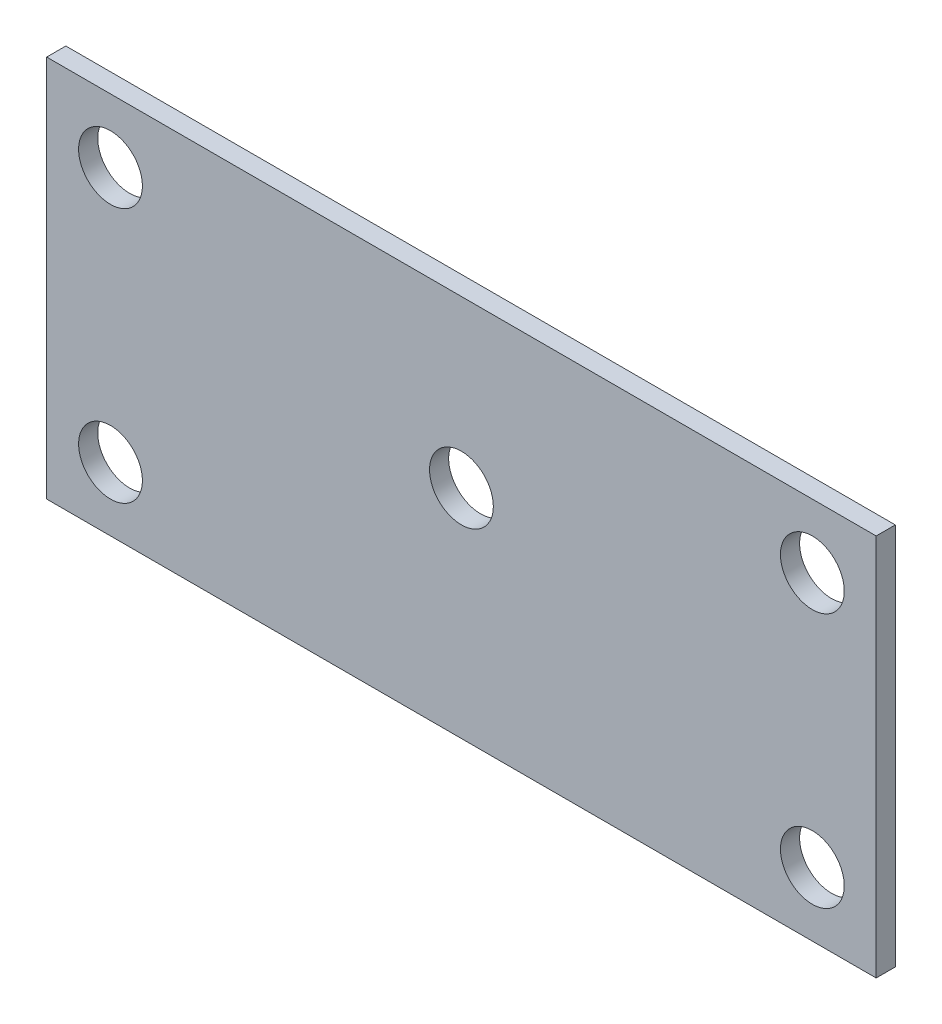
ISO-10303-21;
HEADER;
FILE_DESCRIPTION(('STEP AP214'),'2;1');
FILE_NAME('part.step','',(''),(''),'','','');
FILE_SCHEMA(('AUTOMOTIVE_DESIGN { 1 0 10303 214 1 1 1 1 }'));
ENDSEC;
DATA;
#1=APPLICATION_CONTEXT('core data for automotive mechanical design processes');
#2=APPLICATION_PROTOCOL_DEFINITION('international standard','automotive_design',2000,#1);
#3=PRODUCT_CONTEXT('',#1,'mechanical');
#4=PRODUCT('Part','Part','',(#3));
#5=PRODUCT_RELATED_PRODUCT_CATEGORY('part','',(#4));
#6=PRODUCT_DEFINITION_FORMATION('','',#4);
#7=PRODUCT_DEFINITION_CONTEXT('part definition',#1,'design');
#8=PRODUCT_DEFINITION('design','',#6,#7);
#9=PRODUCT_DEFINITION_SHAPE('','',#8);
#10=(LENGTH_UNIT() NAMED_UNIT(*) SI_UNIT(.MILLI.,.METRE.));
#11=(NAMED_UNIT(*) PLANE_ANGLE_UNIT() SI_UNIT($,.RADIAN.));
#12=(NAMED_UNIT(*) SI_UNIT($,.STERADIAN.) SOLID_ANGLE_UNIT());
#13=UNCERTAINTY_MEASURE_WITH_UNIT(LENGTH_MEASURE(1.E-05),#10,'distance_accuracy_value','');
#14=(GEOMETRIC_REPRESENTATION_CONTEXT(3) GLOBAL_UNCERTAINTY_ASSIGNED_CONTEXT((#13)) GLOBAL_UNIT_ASSIGNED_CONTEXT((#10,
#11,#12)) REPRESENTATION_CONTEXT('',''));
#15=CARTESIAN_POINT('',(0.,0.,0.));
#16=DIRECTION('',(0.,0.,1.));
#17=DIRECTION('',(1.,0.,0.));
#18=AXIS2_PLACEMENT_3D('',#15,#16,#17);
#19=CARTESIAN_POINT('',(45.,34.,3.));
#20=DIRECTION('',(0.,0.,-1.));
#21=DIRECTION('',(-1.,0.,0.));
#22=AXIS2_PLACEMENT_3D('',#19,#20,#21);
#23=CYLINDRICAL_SURFACE('',#22,5.);
#24=CARTESIAN_POINT('',(45.,34.,0.));
#25=DIRECTION('',(0.,0.,1.));
#26=DIRECTION('',(1.,0.,0.));
#27=AXIS2_PLACEMENT_3D('',#24,#25,#26);
#28=CIRCLE('',#27,5.);
#29=CARTESIAN_POINT('',(50.,34.,0.));
#30=VERTEX_POINT('',#29);
#31=EDGE_CURVE('E83',#30,#30,#28,.T.);
#32=ORIENTED_EDGE('',*,*,#31,.F.);
#33=EDGE_LOOP('',(#32));
#34=FACE_BOUND('',#33,.T.);
#35=CARTESIAN_POINT('',(45.,34.,3.));
#36=DIRECTION('',(0.,0.,1.));
#37=DIRECTION('',(1.,0.,0.));
#38=AXIS2_PLACEMENT_3D('',#35,#36,#37);
#39=CIRCLE('',#38,5.);
#40=CARTESIAN_POINT('',(50.,34.,3.));
#41=VERTEX_POINT('',#40);
#42=EDGE_CURVE('E106',#41,#41,#39,.T.);
#43=ORIENTED_EDGE('',*,*,#42,.T.);
#44=EDGE_LOOP('',(#43));
#45=FACE_BOUND('',#44,.T.);
#46=ADVANCED_FACE('F35',(#34,#45),#23,.F.);
#47=CARTESIAN_POINT('',(0.,60.,3.));
#48=DIRECTION('',(0.,1.,0.));
#49=DIRECTION('',(-1.,0.,0.));
#50=AXIS2_PLACEMENT_3D('',#47,#48,#49);
#51=PLANE('',#50);
#52=DIRECTION('',(1.,0.,0.));
#53=VECTOR('',#52,1.);
#54=CARTESIAN_POINT('',(0.,60.,0.));
#55=LINE('',#54,#53);
#56=CARTESIAN_POINT('',(-20.,60.,0.));
#57=VERTEX_POINT('',#56);
#58=CARTESIAN_POINT('',(110.,60.,0.));
#59=VERTEX_POINT('',#58);
#60=EDGE_CURVE('E76',#57,#59,#55,.T.);
#61=ORIENTED_EDGE('',*,*,#60,.F.);
#62=DIRECTION('',(0.,0.,-1.));
#63=VECTOR('',#62,1.);
#64=CARTESIAN_POINT('',(-20.,60.,3.));
#65=LINE('',#64,#63);
#66=CARTESIAN_POINT('',(-20.,60.,3.));
#67=VERTEX_POINT('',#66);
#68=EDGE_CURVE('E11',#67,#57,#65,.T.);
#69=ORIENTED_EDGE('',*,*,#68,.F.);
#70=DIRECTION('',(1.,0.,0.));
#71=VECTOR('',#70,1.);
#72=CARTESIAN_POINT('',(0.,60.,3.));
#73=LINE('',#72,#71);
#74=CARTESIAN_POINT('',(110.,60.,3.));
#75=VERTEX_POINT('',#74);
#76=EDGE_CURVE('E64',#67,#75,#73,.T.);
#77=ORIENTED_EDGE('',*,*,#76,.T.);
#78=DIRECTION('',(0.,0.,-1.));
#79=VECTOR('',#78,1.);
#80=CARTESIAN_POINT('',(110.,60.,3.));
#81=LINE('',#80,#79);
#82=EDGE_CURVE('E90',#75,#59,#81,.T.);
#83=ORIENTED_EDGE('',*,*,#82,.T.);
#84=EDGE_LOOP('',(#61,#69,#77,#83));
#85=FACE_BOUND('',#84,.T.);
#86=ADVANCED_FACE('F95',(#85),#51,.T.);
#87=CARTESIAN_POINT('',(-20.,0.,3.));
#88=DIRECTION('',(-1.,0.,0.));
#89=DIRECTION('',(0.,0.,1.));
#90=AXIS2_PLACEMENT_3D('',#87,#88,#89);
#91=PLANE('',#90);
#92=DIRECTION('',(0.,1.,0.));
#93=VECTOR('',#92,1.);
#94=CARTESIAN_POINT('',(-20.,0.,0.));
#95=LINE('',#94,#93);
#96=CARTESIAN_POINT('',(-20.,0.,0.));
#97=VERTEX_POINT('',#96);
#98=EDGE_CURVE('E82',#97,#57,#95,.T.);
#99=ORIENTED_EDGE('',*,*,#98,.F.);
#100=DIRECTION('',(0.,0.,-1.));
#101=VECTOR('',#100,1.);
#102=CARTESIAN_POINT('',(-20.,0.,3.));
#103=LINE('',#102,#101);
#104=CARTESIAN_POINT('',(-20.,0.,3.));
#105=VERTEX_POINT('',#104);
#106=EDGE_CURVE('E43',#105,#97,#103,.T.);
#107=ORIENTED_EDGE('',*,*,#106,.F.);
#108=DIRECTION('',(0.,1.,0.));
#109=VECTOR('',#108,1.);
#110=CARTESIAN_POINT('',(-20.,0.,3.));
#111=LINE('',#110,#109);
#112=EDGE_CURVE('E111',#105,#67,#111,.T.);
#113=ORIENTED_EDGE('',*,*,#112,.T.);
#114=ORIENTED_EDGE('',*,*,#68,.T.);
#115=EDGE_LOOP('',(#99,#107,#113,#114));
#116=FACE_BOUND('',#115,.T.);
#117=ADVANCED_FACE('F133',(#116),#91,.T.);
#118=CARTESIAN_POINT('',(0.,0.,3.));
#119=DIRECTION('',(0.,1.,0.));
#120=DIRECTION('',(-1.,0.,0.));
#121=AXIS2_PLACEMENT_3D('',#118,#119,#120);
#122=PLANE('',#121);
#123=DIRECTION('',(1.,0.,0.));
#124=VECTOR('',#123,1.);
#125=CARTESIAN_POINT('',(0.,0.,0.));
#126=LINE('',#125,#124);
#127=CARTESIAN_POINT('',(110.,0.,0.));
#128=VERTEX_POINT('',#127);
#129=EDGE_CURVE('E124',#97,#128,#126,.T.);
#130=ORIENTED_EDGE('',*,*,#129,.T.);
#131=DIRECTION('',(0.,0.,-1.));
#132=VECTOR('',#131,1.);
#133=CARTESIAN_POINT('',(110.,0.,3.));
#134=LINE('',#133,#132);
#135=CARTESIAN_POINT('',(110.,0.,3.));
#136=VERTEX_POINT('',#135);
#137=EDGE_CURVE('E92',#136,#128,#134,.T.);
#138=ORIENTED_EDGE('',*,*,#137,.F.);
#139=DIRECTION('',(1.,0.,0.));
#140=VECTOR('',#139,1.);
#141=CARTESIAN_POINT('',(0.,0.,3.));
#142=LINE('',#141,#140);
#143=EDGE_CURVE('E113',#105,#136,#142,.T.);
#144=ORIENTED_EDGE('',*,*,#143,.F.);
#145=ORIENTED_EDGE('',*,*,#106,.T.);
#146=EDGE_LOOP('',(#130,#138,#144,#145));
#147=FACE_BOUND('',#146,.T.);
#148=ADVANCED_FACE('F131',(#147),#122,.F.);
#149=CARTESIAN_POINT('',(-10.,10.,3.));
#150=DIRECTION('',(0.,0.,-1.));
#151=DIRECTION('',(-1.,0.,0.));
#152=AXIS2_PLACEMENT_3D('',#149,#150,#151);
#153=CYLINDRICAL_SURFACE('',#152,5.);
#154=CARTESIAN_POINT('',(-10.,10.,3.));
#155=DIRECTION('',(0.,0.,1.));
#156=DIRECTION('',(1.,0.,0.));
#157=AXIS2_PLACEMENT_3D('',#154,#155,#156);
#158=CIRCLE('',#157,5.);
#159=CARTESIAN_POINT('',(-5.,10.,3.));
#160=VERTEX_POINT('',#159);
#161=EDGE_CURVE('E115',#160,#160,#158,.T.);
#162=ORIENTED_EDGE('',*,*,#161,.T.);
#163=EDGE_LOOP('',(#162));
#164=FACE_BOUND('',#163,.T.);
#165=CARTESIAN_POINT('',(-10.,10.,0.));
#166=DIRECTION('',(0.,0.,1.));
#167=DIRECTION('',(1.,0.,0.));
#168=AXIS2_PLACEMENT_3D('',#165,#166,#167);
#169=CIRCLE('',#168,5.);
#170=CARTESIAN_POINT('',(-5.,10.,0.));
#171=VERTEX_POINT('',#170);
#172=EDGE_CURVE('E126',#171,#171,#169,.T.);
#173=ORIENTED_EDGE('',*,*,#172,.F.);
#174=EDGE_LOOP('',(#173));
#175=FACE_BOUND('',#174,.T.);
#176=ADVANCED_FACE('F140',(#164,#175),#153,.F.);
#177=CARTESIAN_POINT('',(-10.,50.,3.));
#178=DIRECTION('',(0.,0.,-1.));
#179=DIRECTION('',(-1.,0.,0.));
#180=AXIS2_PLACEMENT_3D('',#177,#178,#179);
#181=CYLINDRICAL_SURFACE('',#180,5.00000000000001);
#182=CARTESIAN_POINT('',(-10.,50.,3.));
#183=DIRECTION('',(0.,0.,1.));
#184=DIRECTION('',(1.,0.,0.));
#185=AXIS2_PLACEMENT_3D('',#182,#183,#184);
#186=CIRCLE('',#185,5.00000000000001);
#187=CARTESIAN_POINT('',(-4.99999999999999,50.,3.));
#188=VERTEX_POINT('',#187);
#189=EDGE_CURVE('E118',#188,#188,#186,.T.);
#190=ORIENTED_EDGE('',*,*,#189,.T.);
#191=EDGE_LOOP('',(#190));
#192=FACE_BOUND('',#191,.T.);
#193=CARTESIAN_POINT('',(-10.,50.,0.));
#194=DIRECTION('',(0.,0.,1.));
#195=DIRECTION('',(1.,0.,0.));
#196=AXIS2_PLACEMENT_3D('',#193,#194,#195);
#197=CIRCLE('',#196,5.00000000000001);
#198=CARTESIAN_POINT('',(-4.99999999999999,50.,0.));
#199=VERTEX_POINT('',#198);
#200=EDGE_CURVE('E109',#199,#199,#197,.T.);
#201=ORIENTED_EDGE('',*,*,#200,.F.);
#202=EDGE_LOOP('',(#201));
#203=FACE_BOUND('',#202,.T.);
#204=ADVANCED_FACE('F153',(#192,#203),#181,.F.);
#205=CARTESIAN_POINT('',(0.,0.,3.));
#206=DIRECTION('',(0.,0.,1.));
#207=DIRECTION('',(1.,0.,0.));
#208=AXIS2_PLACEMENT_3D('',#205,#206,#207);
#209=PLANE('',#208);
#210=ORIENTED_EDGE('',*,*,#143,.T.);
#211=DIRECTION('',(0.,1.,0.));
#212=VECTOR('',#211,1.);
#213=CARTESIAN_POINT('',(110.,0.,3.));
#214=LINE('',#213,#212);
#215=EDGE_CURVE('E173',#136,#75,#214,.T.);
#216=ORIENTED_EDGE('',*,*,#215,.T.);
#217=ORIENTED_EDGE('',*,*,#76,.F.);
#218=ORIENTED_EDGE('',*,*,#112,.F.);
#219=EDGE_LOOP('',(#210,#216,#217,#218));
#220=FACE_BOUND('',#219,.T.);
#221=ORIENTED_EDGE('',*,*,#42,.F.);
#222=EDGE_LOOP('',(#221));
#223=FACE_BOUND('',#222,.T.);
#224=ORIENTED_EDGE('',*,*,#161,.F.);
#225=EDGE_LOOP('',(#224));
#226=FACE_BOUND('',#225,.T.);
#227=ORIENTED_EDGE('',*,*,#189,.F.);
#228=EDGE_LOOP('',(#227));
#229=FACE_BOUND('',#228,.T.);
#230=CARTESIAN_POINT('',(100.,10.,3.));
#231=DIRECTION('',(0.,0.,-1.));
#232=DIRECTION('',(-1.,0.,0.));
#233=AXIS2_PLACEMENT_3D('',#230,#231,#232);
#234=CIRCLE('',#233,5.);
#235=CARTESIAN_POINT('',(95.,10.,3.));
#236=VERTEX_POINT('',#235);
#237=EDGE_CURVE('E100',#236,#236,#234,.T.);
#238=ORIENTED_EDGE('',*,*,#237,.T.);
#239=EDGE_LOOP('',(#238));
#240=FACE_BOUND('',#239,.T.);
#241=CARTESIAN_POINT('',(100.,50.,3.));
#242=DIRECTION('',(0.,0.,-1.));
#243=DIRECTION('',(-1.,0.,0.));
#244=AXIS2_PLACEMENT_3D('',#241,#242,#243);
#245=CIRCLE('',#244,5.00000000000001);
#246=CARTESIAN_POINT('',(95.,50.,3.));
#247=VERTEX_POINT('',#246);
#248=EDGE_CURVE('E96',#247,#247,#245,.T.);
#249=ORIENTED_EDGE('',*,*,#248,.T.);
#250=EDGE_LOOP('',(#249));
#251=FACE_BOUND('',#250,.T.);
#252=ADVANCED_FACE('F150',(#220,#223,#226,#229,#240,#251),#209,.T.);
#253=CARTESIAN_POINT('',(0.,0.,0.));
#254=DIRECTION('',(0.,0.,1.));
#255=DIRECTION('',(1.,0.,0.));
#256=AXIS2_PLACEMENT_3D('',#253,#254,#255);
#257=PLANE('',#256);
#258=DIRECTION('',(0.,1.,0.));
#259=VECTOR('',#258,1.);
#260=CARTESIAN_POINT('',(110.,0.,0.));
#261=LINE('',#260,#259);
#262=EDGE_CURVE('E81',#128,#59,#261,.T.);
#263=ORIENTED_EDGE('',*,*,#262,.F.);
#264=ORIENTED_EDGE('',*,*,#129,.F.);
#265=ORIENTED_EDGE('',*,*,#98,.T.);
#266=ORIENTED_EDGE('',*,*,#60,.T.);
#267=EDGE_LOOP('',(#263,#264,#265,#266));
#268=FACE_BOUND('',#267,.T.);
#269=ORIENTED_EDGE('',*,*,#31,.T.);
#270=EDGE_LOOP('',(#269));
#271=FACE_BOUND('',#270,.T.);
#272=ORIENTED_EDGE('',*,*,#172,.T.);
#273=EDGE_LOOP('',(#272));
#274=FACE_BOUND('',#273,.T.);
#275=ORIENTED_EDGE('',*,*,#200,.T.);
#276=EDGE_LOOP('',(#275));
#277=FACE_BOUND('',#276,.T.);
#278=CARTESIAN_POINT('',(100.,10.,0.));
#279=DIRECTION('',(0.,0.,-1.));
#280=DIRECTION('',(-1.,0.,0.));
#281=AXIS2_PLACEMENT_3D('',#278,#279,#280);
#282=CIRCLE('',#281,5.);
#283=CARTESIAN_POINT('',(95.,10.,0.));
#284=VERTEX_POINT('',#283);
#285=EDGE_CURVE('E93',#284,#284,#282,.T.);
#286=ORIENTED_EDGE('',*,*,#285,.F.);
#287=EDGE_LOOP('',(#286));
#288=FACE_BOUND('',#287,.T.);
#289=CARTESIAN_POINT('',(100.,50.,0.));
#290=DIRECTION('',(0.,0.,-1.));
#291=DIRECTION('',(-1.,0.,0.));
#292=AXIS2_PLACEMENT_3D('',#289,#290,#291);
#293=CIRCLE('',#292,5.00000000000001);
#294=CARTESIAN_POINT('',(95.,50.,0.));
#295=VERTEX_POINT('',#294);
#296=EDGE_CURVE('E103',#295,#295,#293,.T.);
#297=ORIENTED_EDGE('',*,*,#296,.F.);
#298=EDGE_LOOP('',(#297));
#299=FACE_BOUND('',#298,.T.);
#300=ADVANCED_FACE('F78',(#268,#271,#274,#277,#288,#299),#257,.F.);
#301=CARTESIAN_POINT('',(110.,0.,3.));
#302=DIRECTION('',(-1.,0.,0.));
#303=DIRECTION('',(0.,-1.,0.));
#304=AXIS2_PLACEMENT_3D('',#301,#302,#303);
#305=PLANE('',#304);
#306=ORIENTED_EDGE('',*,*,#262,.T.);
#307=ORIENTED_EDGE('',*,*,#82,.F.);
#308=ORIENTED_EDGE('',*,*,#215,.F.);
#309=ORIENTED_EDGE('',*,*,#137,.T.);
#310=EDGE_LOOP('',(#306,#307,#308,#309));
#311=FACE_BOUND('',#310,.T.);
#312=ADVANCED_FACE('F88',(#311),#305,.F.);
#313=CARTESIAN_POINT('',(100.,10.,3.));
#314=DIRECTION('',(0.,0.,-1.));
#315=DIRECTION('',(-1.,0.,0.));
#316=AXIS2_PLACEMENT_3D('',#313,#314,#315);
#317=CYLINDRICAL_SURFACE('',#316,5.);
#318=ORIENTED_EDGE('',*,*,#237,.F.);
#319=EDGE_LOOP('',(#318));
#320=FACE_BOUND('',#319,.T.);
#321=ORIENTED_EDGE('',*,*,#285,.T.);
#322=EDGE_LOOP('',(#321));
#323=FACE_BOUND('',#322,.T.);
#324=ADVANCED_FACE('F168',(#320,#323),#317,.F.);
#325=CARTESIAN_POINT('',(100.,50.,3.));
#326=DIRECTION('',(0.,0.,-1.));
#327=DIRECTION('',(-1.,0.,0.));
#328=AXIS2_PLACEMENT_3D('',#325,#326,#327);
#329=CYLINDRICAL_SURFACE('',#328,5.00000000000001);
#330=ORIENTED_EDGE('',*,*,#248,.F.);
#331=EDGE_LOOP('',(#330));
#332=FACE_BOUND('',#331,.T.);
#333=ORIENTED_EDGE('',*,*,#296,.T.);
#334=EDGE_LOOP('',(#333));
#335=FACE_BOUND('',#334,.T.);
#336=ADVANCED_FACE('F165',(#332,#335),#329,.F.);
#337=CLOSED_SHELL('',(#46,#86,#117,#148,#176,#204,#252,#300,#312,#324,#336));
#338=MANIFOLD_SOLID_BREP('B2',#337);
#339=ADVANCED_BREP_SHAPE_REPRESENTATION('',(#18,#338),#14);
#340=SHAPE_DEFINITION_REPRESENTATION(#9,#339);
ENDSEC;
END-ISO-10303-21;
